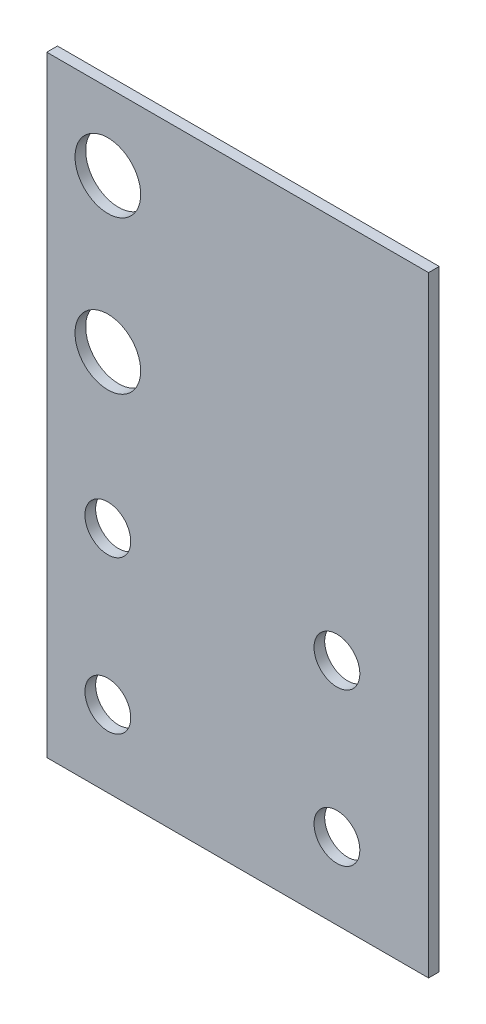
ISO-10303-21;
HEADER;
FILE_DESCRIPTION(('STEP AP214'),'2;1');
FILE_NAME('part.step','',(''),(''),'','','');
FILE_SCHEMA(('AUTOMOTIVE_DESIGN { 1 0 10303 214 1 1 1 1 }'));
ENDSEC;
DATA;
#1=APPLICATION_CONTEXT('core data for automotive mechanical design processes');
#2=APPLICATION_PROTOCOL_DEFINITION('international standard','automotive_design',2000,#1);
#3=PRODUCT_CONTEXT('',#1,'mechanical');
#4=PRODUCT('Part','Part','',(#3));
#5=PRODUCT_RELATED_PRODUCT_CATEGORY('part','',(#4));
#6=PRODUCT_DEFINITION_FORMATION('','',#4);
#7=PRODUCT_DEFINITION_CONTEXT('part definition',#1,'design');
#8=PRODUCT_DEFINITION('design','',#6,#7);
#9=PRODUCT_DEFINITION_SHAPE('','',#8);
#10=(LENGTH_UNIT() NAMED_UNIT(*) SI_UNIT(.MILLI.,.METRE.));
#11=(NAMED_UNIT(*) PLANE_ANGLE_UNIT() SI_UNIT($,.RADIAN.));
#12=(NAMED_UNIT(*) SI_UNIT($,.STERADIAN.) SOLID_ANGLE_UNIT());
#13=UNCERTAINTY_MEASURE_WITH_UNIT(LENGTH_MEASURE(1.E-05),#10,'distance_accuracy_value','');
#14=(GEOMETRIC_REPRESENTATION_CONTEXT(3) GLOBAL_UNCERTAINTY_ASSIGNED_CONTEXT((#13)) GLOBAL_UNIT_ASSIGNED_CONTEXT((#10,
#11,#12)) REPRESENTATION_CONTEXT('',''));
#15=CARTESIAN_POINT('',(0.,0.,0.));
#16=DIRECTION('',(0.,0.,1.));
#17=DIRECTION('',(1.,0.,0.));
#18=AXIS2_PLACEMENT_3D('',#15,#16,#17);
#19=CARTESIAN_POINT('',(0.,40.,0.));
#20=DIRECTION('',(1.,0.,0.));
#21=DIRECTION('',(0.,0.,-1.));
#22=AXIS2_PLACEMENT_3D('',#19,#20,#21);
#23=PLANE('',#22);
#24=DIRECTION('',(0.,0.,1.));
#25=VECTOR('',#24,1.);
#26=CARTESIAN_POINT('',(0.,0.,0.));
#27=LINE('',#26,#25);
#28=CARTESIAN_POINT('',(0.,0.,-0.7));
#29=VERTEX_POINT('',#28);
#30=CARTESIAN_POINT('',(0.,0.,0.));
#31=VERTEX_POINT('',#30);
#32=EDGE_CURVE('E110',#29,#31,#27,.T.);
#33=ORIENTED_EDGE('',*,*,#32,.T.);
#34=DIRECTION('',(0.,-1.,0.));
#35=VECTOR('',#34,1.);
#36=CARTESIAN_POINT('',(0.,40.,0.));
#37=LINE('',#36,#35);
#38=CARTESIAN_POINT('',(0.,40.,0.));
#39=VERTEX_POINT('',#38);
#40=EDGE_CURVE('E11',#39,#31,#37,.T.);
#41=ORIENTED_EDGE('',*,*,#40,.F.);
#42=DIRECTION('',(0.,0.,1.));
#43=VECTOR('',#42,1.);
#44=CARTESIAN_POINT('',(0.,40.,0.));
#45=LINE('',#44,#43);
#46=CARTESIAN_POINT('',(0.,40.,-0.7));
#47=VERTEX_POINT('',#46);
#48=EDGE_CURVE('E93',#47,#39,#45,.T.);
#49=ORIENTED_EDGE('',*,*,#48,.F.);
#50=DIRECTION('',(0.,-1.,0.));
#51=VECTOR('',#50,1.);
#52=CARTESIAN_POINT('',(0.,40.,-0.7));
#53=LINE('',#52,#51);
#54=EDGE_CURVE('E106',#47,#29,#53,.T.);
#55=ORIENTED_EDGE('',*,*,#54,.T.);
#56=EDGE_LOOP('',(#33,#41,#49,#55));
#57=FACE_BOUND('',#56,.T.);
#58=ADVANCED_FACE('F39',(#57),#23,.F.);
#59=CARTESIAN_POINT('',(0.,40.,0.));
#60=DIRECTION('',(0.,0.,-1.));
#61=DIRECTION('',(-1.,0.,0.));
#62=AXIS2_PLACEMENT_3D('',#59,#60,#61);
#63=PLANE('',#62);
#64=CARTESIAN_POINT('',(4.,35.,0.));
#65=DIRECTION('',(0.,0.,1.));
#66=DIRECTION('',(1.,0.,0.));
#67=AXIS2_PLACEMENT_3D('',#64,#65,#66);
#68=CIRCLE('',#67,2.15);
#69=CARTESIAN_POINT('',(6.15,35.,0.));
#70=VERTEX_POINT('',#69);
#71=EDGE_CURVE('E129',#70,#70,#68,.T.);
#72=ORIENTED_EDGE('',*,*,#71,.F.);
#73=EDGE_LOOP('',(#72));
#74=FACE_BOUND('',#73,.T.);
#75=CARTESIAN_POINT('',(19.,5.,0.));
#76=DIRECTION('',(0.,0.,1.));
#77=DIRECTION('',(1.,0.,0.));
#78=AXIS2_PLACEMENT_3D('',#75,#76,#77);
#79=CIRCLE('',#78,1.5);
#80=CARTESIAN_POINT('',(20.5,5.,0.));
#81=VERTEX_POINT('',#80);
#82=EDGE_CURVE('E294',#81,#81,#79,.T.);
#83=ORIENTED_EDGE('',*,*,#82,.F.);
#84=EDGE_LOOP('',(#83));
#85=FACE_BOUND('',#84,.T.);
#86=CARTESIAN_POINT('',(4.,25.,0.));
#87=DIRECTION('',(0.,0.,1.));
#88=DIRECTION('',(1.,0.,0.));
#89=AXIS2_PLACEMENT_3D('',#86,#87,#88);
#90=CIRCLE('',#89,2.15);
#91=CARTESIAN_POINT('',(6.15,25.,0.));
#92=VERTEX_POINT('',#91);
#93=EDGE_CURVE('E266',#92,#92,#90,.T.);
#94=ORIENTED_EDGE('',*,*,#93,.F.);
#95=EDGE_LOOP('',(#94));
#96=FACE_BOUND('',#95,.T.);
#97=CARTESIAN_POINT('',(4.,15.,0.));
#98=DIRECTION('',(0.,0.,1.));
#99=DIRECTION('',(1.,0.,0.));
#100=AXIS2_PLACEMENT_3D('',#97,#98,#99);
#101=CIRCLE('',#100,1.5);
#102=CARTESIAN_POINT('',(5.5,15.,0.));
#103=VERTEX_POINT('',#102);
#104=EDGE_CURVE('E280',#103,#103,#101,.T.);
#105=ORIENTED_EDGE('',*,*,#104,.F.);
#106=EDGE_LOOP('',(#105));
#107=FACE_BOUND('',#106,.T.);
#108=CARTESIAN_POINT('',(4.,5.,0.));
#109=DIRECTION('',(0.,0.,1.));
#110=DIRECTION('',(1.,0.,0.));
#111=AXIS2_PLACEMENT_3D('',#108,#109,#110);
#112=CIRCLE('',#111,1.5);
#113=CARTESIAN_POINT('',(5.5,5.,0.));
#114=VERTEX_POINT('',#113);
#115=EDGE_CURVE('E286',#114,#114,#112,.T.);
#116=ORIENTED_EDGE('',*,*,#115,.F.);
#117=EDGE_LOOP('',(#116));
#118=FACE_BOUND('',#117,.T.);
#119=CARTESIAN_POINT('',(19.,15.,0.));
#120=DIRECTION('',(0.,0.,1.));
#121=DIRECTION('',(1.,0.,0.));
#122=AXIS2_PLACEMENT_3D('',#119,#120,#121);
#123=CIRCLE('',#122,1.5);
#124=CARTESIAN_POINT('',(20.5,15.,0.));
#125=VERTEX_POINT('',#124);
#126=EDGE_CURVE('E289',#125,#125,#123,.T.);
#127=ORIENTED_EDGE('',*,*,#126,.F.);
#128=EDGE_LOOP('',(#127));
#129=FACE_BOUND('',#128,.T.);
#130=DIRECTION('',(1.,0.,0.));
#131=VECTOR('',#130,1.);
#132=CARTESIAN_POINT('',(0.,0.,0.));
#133=LINE('',#132,#131);
#134=CARTESIAN_POINT('',(25.,0.,0.));
#135=VERTEX_POINT('',#134);
#136=EDGE_CURVE('E98',#31,#135,#133,.T.);
#137=ORIENTED_EDGE('',*,*,#136,.T.);
#138=DIRECTION('',(0.,-1.,0.));
#139=VECTOR('',#138,1.);
#140=CARTESIAN_POINT('',(25.,40.,0.));
#141=LINE('',#140,#139);
#142=CARTESIAN_POINT('',(25.,40.,0.));
#143=VERTEX_POINT('',#142);
#144=EDGE_CURVE('E49',#143,#135,#141,.T.);
#145=ORIENTED_EDGE('',*,*,#144,.F.);
#146=DIRECTION('',(1.,0.,0.));
#147=VECTOR('',#146,1.);
#148=CARTESIAN_POINT('',(0.,40.,0.));
#149=LINE('',#148,#147);
#150=EDGE_CURVE('E88',#39,#143,#149,.T.);
#151=ORIENTED_EDGE('',*,*,#150,.F.);
#152=ORIENTED_EDGE('',*,*,#40,.T.);
#153=EDGE_LOOP('',(#137,#145,#151,#152));
#154=FACE_BOUND('',#153,.T.);
#155=ADVANCED_FACE('F97',(#74,#85,#96,#107,#118,#129,#154),#63,.F.);
#156=CARTESIAN_POINT('',(25.,40.,0.));
#157=DIRECTION('',(-1.,0.,0.));
#158=DIRECTION('',(0.,0.,1.));
#159=AXIS2_PLACEMENT_3D('',#156,#157,#158);
#160=PLANE('',#159);
#161=DIRECTION('',(0.,0.,-1.));
#162=VECTOR('',#161,1.);
#163=CARTESIAN_POINT('',(25.,0.,0.));
#164=LINE('',#163,#162);
#165=CARTESIAN_POINT('',(25.,0.,-0.7));
#166=VERTEX_POINT('',#165);
#167=EDGE_CURVE('E75',#135,#166,#164,.T.);
#168=ORIENTED_EDGE('',*,*,#167,.T.);
#169=DIRECTION('',(0.,-1.,0.));
#170=VECTOR('',#169,1.);
#171=CARTESIAN_POINT('',(25.,40.,-0.7));
#172=LINE('',#171,#170);
#173=CARTESIAN_POINT('',(25.,40.,-0.7));
#174=VERTEX_POINT('',#173);
#175=EDGE_CURVE('E100',#174,#166,#172,.T.);
#176=ORIENTED_EDGE('',*,*,#175,.F.);
#177=DIRECTION('',(0.,0.,-1.));
#178=VECTOR('',#177,1.);
#179=CARTESIAN_POINT('',(25.,40.,0.));
#180=LINE('',#179,#178);
#181=EDGE_CURVE('E91',#143,#174,#180,.T.);
#182=ORIENTED_EDGE('',*,*,#181,.F.);
#183=ORIENTED_EDGE('',*,*,#144,.T.);
#184=EDGE_LOOP('',(#168,#176,#182,#183));
#185=FACE_BOUND('',#184,.T.);
#186=ADVANCED_FACE('F102',(#185),#160,.F.);
#187=CARTESIAN_POINT('',(0.,40.,-0.7));
#188=DIRECTION('',(0.,0.,1.));
#189=DIRECTION('',(1.,0.,0.));
#190=AXIS2_PLACEMENT_3D('',#187,#188,#189);
#191=PLANE('',#190);
#192=CARTESIAN_POINT('',(4.,35.,-0.699999999999999));
#193=DIRECTION('',(0.,0.,1.));
#194=DIRECTION('',(1.,0.,0.));
#195=AXIS2_PLACEMENT_3D('',#192,#193,#194);
#196=CIRCLE('',#195,2.15);
#197=CARTESIAN_POINT('',(6.15,35.,-0.699999999999999));
#198=VERTEX_POINT('',#197);
#199=EDGE_CURVE('E42',#198,#198,#196,.T.);
#200=ORIENTED_EDGE('',*,*,#199,.T.);
#201=EDGE_LOOP('',(#200));
#202=FACE_BOUND('',#201,.T.);
#203=CARTESIAN_POINT('',(19.,5.,-0.699999999999999));
#204=DIRECTION('',(0.,0.,1.));
#205=DIRECTION('',(1.,0.,0.));
#206=AXIS2_PLACEMENT_3D('',#203,#204,#205);
#207=CIRCLE('',#206,1.5);
#208=CARTESIAN_POINT('',(20.5,5.,-0.699999999999999));
#209=VERTEX_POINT('',#208);
#210=EDGE_CURVE('E140',#209,#209,#207,.T.);
#211=ORIENTED_EDGE('',*,*,#210,.T.);
#212=EDGE_LOOP('',(#211));
#213=FACE_BOUND('',#212,.T.);
#214=CARTESIAN_POINT('',(4.,25.,-0.699999999999999));
#215=DIRECTION('',(0.,0.,1.));
#216=DIRECTION('',(1.,0.,0.));
#217=AXIS2_PLACEMENT_3D('',#214,#215,#216);
#218=CIRCLE('',#217,2.15);
#219=CARTESIAN_POINT('',(6.15,25.,-0.699999999999999));
#220=VERTEX_POINT('',#219);
#221=EDGE_CURVE('E137',#220,#220,#218,.T.);
#222=ORIENTED_EDGE('',*,*,#221,.T.);
#223=EDGE_LOOP('',(#222));
#224=FACE_BOUND('',#223,.T.);
#225=CARTESIAN_POINT('',(4.,15.,-0.699999999999999));
#226=DIRECTION('',(0.,0.,1.));
#227=DIRECTION('',(1.,0.,0.));
#228=AXIS2_PLACEMENT_3D('',#225,#226,#227);
#229=CIRCLE('',#228,1.5);
#230=CARTESIAN_POINT('',(5.5,15.,-0.699999999999999));
#231=VERTEX_POINT('',#230);
#232=EDGE_CURVE('E133',#231,#231,#229,.T.);
#233=ORIENTED_EDGE('',*,*,#232,.T.);
#234=EDGE_LOOP('',(#233));
#235=FACE_BOUND('',#234,.T.);
#236=CARTESIAN_POINT('',(4.,5.,-0.699999999999999));
#237=DIRECTION('',(0.,0.,1.));
#238=DIRECTION('',(1.,0.,0.));
#239=AXIS2_PLACEMENT_3D('',#236,#237,#238);
#240=CIRCLE('',#239,1.5);
#241=CARTESIAN_POINT('',(5.5,5.,-0.699999999999999));
#242=VERTEX_POINT('',#241);
#243=EDGE_CURVE('E128',#242,#242,#240,.T.);
#244=ORIENTED_EDGE('',*,*,#243,.T.);
#245=EDGE_LOOP('',(#244));
#246=FACE_BOUND('',#245,.T.);
#247=CARTESIAN_POINT('',(19.,15.,-0.699999999999999));
#248=DIRECTION('',(0.,0.,1.));
#249=DIRECTION('',(1.,0.,0.));
#250=AXIS2_PLACEMENT_3D('',#247,#248,#249);
#251=CIRCLE('',#250,1.5);
#252=CARTESIAN_POINT('',(20.5,15.,-0.699999999999999));
#253=VERTEX_POINT('',#252);
#254=EDGE_CURVE('E124',#253,#253,#251,.T.);
#255=ORIENTED_EDGE('',*,*,#254,.T.);
#256=EDGE_LOOP('',(#255));
#257=FACE_BOUND('',#256,.T.);
#258=DIRECTION('',(-1.,0.,0.));
#259=VECTOR('',#258,1.);
#260=CARTESIAN_POINT('',(0.,0.,-0.7));
#261=LINE('',#260,#259);
#262=EDGE_CURVE('E81',#166,#29,#261,.T.);
#263=ORIENTED_EDGE('',*,*,#262,.T.);
#264=ORIENTED_EDGE('',*,*,#54,.F.);
#265=DIRECTION('',(-1.,0.,0.));
#266=VECTOR('',#265,1.);
#267=CARTESIAN_POINT('',(0.,40.,-0.7));
#268=LINE('',#267,#266);
#269=EDGE_CURVE('E58',#174,#47,#268,.T.);
#270=ORIENTED_EDGE('',*,*,#269,.F.);
#271=ORIENTED_EDGE('',*,*,#175,.T.);
#272=EDGE_LOOP('',(#263,#264,#270,#271));
#273=FACE_BOUND('',#272,.T.);
#274=ADVANCED_FACE('F149',(#202,#213,#224,#235,#246,#257,#273),#191,.F.);
#275=CARTESIAN_POINT('',(0.,40.,0.));
#276=DIRECTION('',(0.,-1.,0.));
#277=DIRECTION('',(0.,0.,-1.));
#278=AXIS2_PLACEMENT_3D('',#275,#276,#277);
#279=PLANE('',#278);
#280=ORIENTED_EDGE('',*,*,#48,.T.);
#281=ORIENTED_EDGE('',*,*,#150,.T.);
#282=ORIENTED_EDGE('',*,*,#181,.T.);
#283=ORIENTED_EDGE('',*,*,#269,.T.);
#284=EDGE_LOOP('',(#280,#281,#282,#283));
#285=FACE_BOUND('',#284,.T.);
#286=ADVANCED_FACE('F89',(#285),#279,.F.);
#287=CARTESIAN_POINT('',(0.,0.,0.));
#288=DIRECTION('',(0.,-1.,0.));
#289=DIRECTION('',(0.,0.,-1.));
#290=AXIS2_PLACEMENT_3D('',#287,#288,#289);
#291=PLANE('',#290);
#292=ORIENTED_EDGE('',*,*,#32,.F.);
#293=ORIENTED_EDGE('',*,*,#262,.F.);
#294=ORIENTED_EDGE('',*,*,#167,.F.);
#295=ORIENTED_EDGE('',*,*,#136,.F.);
#296=EDGE_LOOP('',(#292,#293,#294,#295));
#297=FACE_BOUND('',#296,.T.);
#298=ADVANCED_FACE('F171',(#297),#291,.T.);
#299=CARTESIAN_POINT('',(19.,15.,-40.));
#300=DIRECTION('',(0.,0.,1.));
#301=DIRECTION('',(1.,0.,0.));
#302=AXIS2_PLACEMENT_3D('',#299,#300,#301);
#303=CYLINDRICAL_SURFACE('',#302,1.5);
#304=ORIENTED_EDGE('',*,*,#126,.T.);
#305=EDGE_LOOP('',(#304));
#306=FACE_BOUND('',#305,.T.);
#307=ORIENTED_EDGE('',*,*,#254,.F.);
#308=EDGE_LOOP('',(#307));
#309=FACE_BOUND('',#308,.T.);
#310=ADVANCED_FACE('F173',(#306,#309),#303,.F.);
#311=CARTESIAN_POINT('',(4.,5.,-40.));
#312=DIRECTION('',(0.,0.,1.));
#313=DIRECTION('',(1.,0.,0.));
#314=AXIS2_PLACEMENT_3D('',#311,#312,#313);
#315=CYLINDRICAL_SURFACE('',#314,1.5);
#316=ORIENTED_EDGE('',*,*,#115,.T.);
#317=EDGE_LOOP('',(#316));
#318=FACE_BOUND('',#317,.T.);
#319=ORIENTED_EDGE('',*,*,#243,.F.);
#320=EDGE_LOOP('',(#319));
#321=FACE_BOUND('',#320,.T.);
#322=ADVANCED_FACE('F179',(#318,#321),#315,.F.);
#323=CARTESIAN_POINT('',(4.,15.,-40.));
#324=DIRECTION('',(0.,0.,1.));
#325=DIRECTION('',(1.,0.,0.));
#326=AXIS2_PLACEMENT_3D('',#323,#324,#325);
#327=CYLINDRICAL_SURFACE('',#326,1.5);
#328=ORIENTED_EDGE('',*,*,#104,.T.);
#329=EDGE_LOOP('',(#328));
#330=FACE_BOUND('',#329,.T.);
#331=ORIENTED_EDGE('',*,*,#232,.F.);
#332=EDGE_LOOP('',(#331));
#333=FACE_BOUND('',#332,.T.);
#334=ADVANCED_FACE('F231',(#330,#333),#327,.F.);
#335=CARTESIAN_POINT('',(4.,25.,-40.));
#336=DIRECTION('',(0.,0.,1.));
#337=DIRECTION('',(1.,0.,0.));
#338=AXIS2_PLACEMENT_3D('',#335,#336,#337);
#339=CYLINDRICAL_SURFACE('',#338,2.15);
#340=ORIENTED_EDGE('',*,*,#93,.T.);
#341=EDGE_LOOP('',(#340));
#342=FACE_BOUND('',#341,.T.);
#343=ORIENTED_EDGE('',*,*,#221,.F.);
#344=EDGE_LOOP('',(#343));
#345=FACE_BOUND('',#344,.T.);
#346=ADVANCED_FACE('F159',(#342,#345),#339,.F.);
#347=CARTESIAN_POINT('',(19.,5.,-40.));
#348=DIRECTION('',(0.,0.,1.));
#349=DIRECTION('',(1.,0.,0.));
#350=AXIS2_PLACEMENT_3D('',#347,#348,#349);
#351=CYLINDRICAL_SURFACE('',#350,1.5);
#352=ORIENTED_EDGE('',*,*,#82,.T.);
#353=EDGE_LOOP('',(#352));
#354=FACE_BOUND('',#353,.T.);
#355=ORIENTED_EDGE('',*,*,#210,.F.);
#356=EDGE_LOOP('',(#355));
#357=FACE_BOUND('',#356,.T.);
#358=ADVANCED_FACE('F153',(#354,#357),#351,.F.);
#359=CARTESIAN_POINT('',(4.,35.,-40.));
#360=DIRECTION('',(0.,0.,1.));
#361=DIRECTION('',(1.,0.,0.));
#362=AXIS2_PLACEMENT_3D('',#359,#360,#361);
#363=CYLINDRICAL_SURFACE('',#362,2.15);
#364=ORIENTED_EDGE('',*,*,#71,.T.);
#365=EDGE_LOOP('',(#364));
#366=FACE_BOUND('',#365,.T.);
#367=ORIENTED_EDGE('',*,*,#199,.F.);
#368=EDGE_LOOP('',(#367));
#369=FACE_BOUND('',#368,.T.);
#370=ADVANCED_FACE('F151',(#366,#369),#363,.F.);
#371=CLOSED_SHELL('',(#58,#155,#186,#274,#286,#298,#310,#322,#334,#346,#358,#370));
#372=MANIFOLD_SOLID_BREP('B2',#371);
#373=ADVANCED_BREP_SHAPE_REPRESENTATION('',(#18,#372),#14);
#374=SHAPE_DEFINITION_REPRESENTATION(#9,#373);
ENDSEC;
END-ISO-10303-21;
